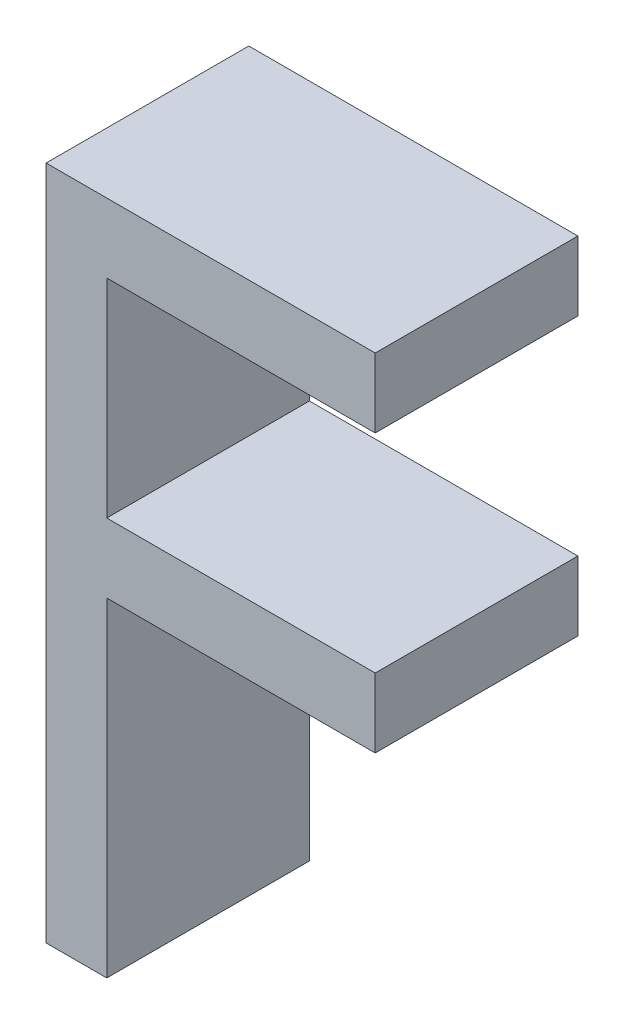
ISO-10303-21;
HEADER;
FILE_DESCRIPTION(('STEP AP214'),'2;1');
FILE_NAME('part.step','',(''),(''),'','','');
FILE_SCHEMA(('AUTOMOTIVE_DESIGN { 1 0 10303 214 1 1 1 1 }'));
ENDSEC;
DATA;
#1=APPLICATION_CONTEXT('core data for automotive mechanical design processes');
#2=APPLICATION_PROTOCOL_DEFINITION('international standard','automotive_design',2000,#1);
#3=PRODUCT_CONTEXT('',#1,'mechanical');
#4=PRODUCT('Part','Part','',(#3));
#5=PRODUCT_RELATED_PRODUCT_CATEGORY('part','',(#4));
#6=PRODUCT_DEFINITION_FORMATION('','',#4);
#7=PRODUCT_DEFINITION_CONTEXT('part definition',#1,'design');
#8=PRODUCT_DEFINITION('design','',#6,#7);
#9=PRODUCT_DEFINITION_SHAPE('','',#8);
#10=(LENGTH_UNIT() NAMED_UNIT(*) SI_UNIT(.MILLI.,.METRE.));
#11=(NAMED_UNIT(*) PLANE_ANGLE_UNIT() SI_UNIT($,.RADIAN.));
#12=(NAMED_UNIT(*) SI_UNIT($,.STERADIAN.) SOLID_ANGLE_UNIT());
#13=UNCERTAINTY_MEASURE_WITH_UNIT(LENGTH_MEASURE(1.E-05),#10,'distance_accuracy_value','');
#14=(GEOMETRIC_REPRESENTATION_CONTEXT(3) GLOBAL_UNCERTAINTY_ASSIGNED_CONTEXT((#13)) GLOBAL_UNIT_ASSIGNED_CONTEXT((#10,
#11,#12)) REPRESENTATION_CONTEXT('',''));
#15=CARTESIAN_POINT('',(0.,0.,0.));
#16=DIRECTION('',(0.,0.,1.));
#17=DIRECTION('',(1.,0.,0.));
#18=AXIS2_PLACEMENT_3D('',#15,#16,#17);
#19=CARTESIAN_POINT('',(-55.4324653258695,-22.8701190762308,1.5));
#20=DIRECTION('',(-1.,0.,0.));
#21=DIRECTION('',(0.,0.,1.));
#22=AXIS2_PLACEMENT_3D('',#19,#20,#21);
#23=PLANE('',#22);
#24=DIRECTION('',(0.,1.,0.));
#25=VECTOR('',#24,1.);
#26=CARTESIAN_POINT('',(-55.4324653258695,-22.8701190762308,0.));
#27=LINE('',#26,#25);
#28=CARTESIAN_POINT('',(-55.4324653258695,-22.8701190762308,0.));
#29=VERTEX_POINT('',#28);
#30=CARTESIAN_POINT('',(-55.4324653258695,-17.8701190762308,0.));
#31=VERTEX_POINT('',#30);
#32=EDGE_CURVE('E142',#29,#31,#27,.T.);
#33=ORIENTED_EDGE('',*,*,#32,.F.);
#34=DIRECTION('',(0.,0.,-1.));
#35=VECTOR('',#34,1.);
#36=CARTESIAN_POINT('',(-55.4324653258695,-22.8701190762308,1.5));
#37=LINE('',#36,#35);
#38=CARTESIAN_POINT('',(-55.4324653258695,-22.8701190762308,1.5));
#39=VERTEX_POINT('',#38);
#40=EDGE_CURVE('E11',#39,#29,#37,.T.);
#41=ORIENTED_EDGE('',*,*,#40,.F.);
#42=DIRECTION('',(0.,1.,0.));
#43=VECTOR('',#42,1.);
#44=CARTESIAN_POINT('',(-55.4324653258695,-22.8701190762308,1.5));
#45=LINE('',#44,#43);
#46=CARTESIAN_POINT('',(-55.4324653258695,-17.8701190762308,1.5));
#47=VERTEX_POINT('',#46);
#48=EDGE_CURVE('E168',#39,#47,#45,.T.);
#49=ORIENTED_EDGE('',*,*,#48,.T.);
#50=DIRECTION('',(0.,0.,-1.));
#51=VECTOR('',#50,1.);
#52=CARTESIAN_POINT('',(-55.4324653258695,-17.8701190762308,1.5));
#53=LINE('',#52,#51);
#54=EDGE_CURVE('E36',#47,#31,#53,.T.);
#55=ORIENTED_EDGE('',*,*,#54,.T.);
#56=EDGE_LOOP('',(#33,#41,#49,#55));
#57=FACE_BOUND('',#56,.T.);
#58=ADVANCED_FACE('F33',(#57),#23,.T.);
#59=CARTESIAN_POINT('',(-54.9837473771516,-22.8701190762308,1.5));
#60=DIRECTION('',(0.,-1.,0.));
#61=DIRECTION('',(0.,0.,-1.));
#62=AXIS2_PLACEMENT_3D('',#59,#60,#61);
#63=PLANE('',#62);
#64=DIRECTION('',(-1.,0.,0.));
#65=VECTOR('',#64,1.);
#66=CARTESIAN_POINT('',(-54.9837473771516,-22.8701190762308,0.));
#67=LINE('',#66,#65);
#68=CARTESIAN_POINT('',(-54.9837473771516,-22.8701190762308,0.));
#69=VERTEX_POINT('',#68);
#70=EDGE_CURVE('E166',#69,#29,#67,.T.);
#71=ORIENTED_EDGE('',*,*,#70,.F.);
#72=DIRECTION('',(0.,0.,-1.));
#73=VECTOR('',#72,1.);
#74=CARTESIAN_POINT('',(-54.9837473771516,-22.8701190762308,1.5));
#75=LINE('',#74,#73);
#76=CARTESIAN_POINT('',(-54.9837473771516,-22.8701190762308,1.5));
#77=VERTEX_POINT('',#76);
#78=EDGE_CURVE('E42',#77,#69,#75,.T.);
#79=ORIENTED_EDGE('',*,*,#78,.F.);
#80=DIRECTION('',(-1.,0.,0.));
#81=VECTOR('',#80,1.);
#82=CARTESIAN_POINT('',(-54.9837473771516,-22.8701190762308,1.5));
#83=LINE('',#82,#81);
#84=EDGE_CURVE('E132',#77,#39,#83,.T.);
#85=ORIENTED_EDGE('',*,*,#84,.T.);
#86=ORIENTED_EDGE('',*,*,#40,.T.);
#87=EDGE_LOOP('',(#71,#79,#85,#86));
#88=FACE_BOUND('',#87,.T.);
#89=ADVANCED_FACE('F184',(#88),#63,.T.);
#90=CARTESIAN_POINT('',(-54.9837473771516,-20.4342216403334,1.5));
#91=DIRECTION('',(1.,0.,0.));
#92=DIRECTION('',(0.,0.,-1.));
#93=AXIS2_PLACEMENT_3D('',#90,#91,#92);
#94=PLANE('',#93);
#95=DIRECTION('',(0.,-1.,0.));
#96=VECTOR('',#95,1.);
#97=CARTESIAN_POINT('',(-54.9837473771516,-20.4342216403334,0.));
#98=LINE('',#97,#96);
#99=CARTESIAN_POINT('',(-54.9837473771516,-20.4342216403334,0.));
#100=VERTEX_POINT('',#99);
#101=EDGE_CURVE('E119',#100,#69,#98,.T.);
#102=ORIENTED_EDGE('',*,*,#101,.F.);
#103=DIRECTION('',(0.,0.,-1.));
#104=VECTOR('',#103,1.);
#105=CARTESIAN_POINT('',(-54.9837473771516,-20.4342216403334,1.5));
#106=LINE('',#105,#104);
#107=CARTESIAN_POINT('',(-54.9837473771516,-20.4342216403334,1.5));
#108=VERTEX_POINT('',#107);
#109=EDGE_CURVE('E114',#108,#100,#106,.T.);
#110=ORIENTED_EDGE('',*,*,#109,.F.);
#111=DIRECTION('',(0.,-1.,0.));
#112=VECTOR('',#111,1.);
#113=CARTESIAN_POINT('',(-54.9837473771516,-20.4342216403334,1.5));
#114=LINE('',#113,#112);
#115=EDGE_CURVE('E117',#108,#77,#114,.T.);
#116=ORIENTED_EDGE('',*,*,#115,.T.);
#117=ORIENTED_EDGE('',*,*,#78,.T.);
#118=EDGE_LOOP('',(#102,#110,#116,#117));
#119=FACE_BOUND('',#118,.T.);
#120=ADVANCED_FACE('F116',(#119),#94,.T.);
#121=CARTESIAN_POINT('',(-52.9965678899721,-20.4342216403334,1.5));
#122=DIRECTION('',(0.,-1.,0.));
#123=DIRECTION('',(0.,0.,-1.));
#124=AXIS2_PLACEMENT_3D('',#121,#122,#123);
#125=PLANE('',#124);
#126=DIRECTION('',(-1.,0.,0.));
#127=VECTOR('',#126,1.);
#128=CARTESIAN_POINT('',(-52.9965678899721,-20.4342216403334,0.));
#129=LINE('',#128,#127);
#130=CARTESIAN_POINT('',(-52.9965678899721,-20.4342216403334,0.));
#131=VERTEX_POINT('',#130);
#132=EDGE_CURVE('E163',#131,#100,#129,.T.);
#133=ORIENTED_EDGE('',*,*,#132,.F.);
#134=DIRECTION('',(0.,0.,-1.));
#135=VECTOR('',#134,1.);
#136=CARTESIAN_POINT('',(-52.9965678899721,-20.4342216403334,1.5));
#137=LINE('',#136,#135);
#138=CARTESIAN_POINT('',(-52.9965678899721,-20.4342216403334,1.5));
#139=VERTEX_POINT('',#138);
#140=EDGE_CURVE('E124',#139,#131,#137,.T.);
#141=ORIENTED_EDGE('',*,*,#140,.F.);
#142=DIRECTION('',(-1.,0.,0.));
#143=VECTOR('',#142,1.);
#144=CARTESIAN_POINT('',(-52.9965678899721,-20.4342216403334,1.5));
#145=LINE('',#144,#143);
#146=EDGE_CURVE('E130',#139,#108,#145,.T.);
#147=ORIENTED_EDGE('',*,*,#146,.T.);
#148=ORIENTED_EDGE('',*,*,#109,.T.);
#149=EDGE_LOOP('',(#133,#141,#147,#148));
#150=FACE_BOUND('',#149,.T.);
#151=ADVANCED_FACE('F134',(#150),#125,.T.);
#152=CARTESIAN_POINT('',(-52.9965678899721,-19.9214011275129,1.5));
#153=DIRECTION('',(1.,0.,0.));
#154=DIRECTION('',(0.,0.,-1.));
#155=AXIS2_PLACEMENT_3D('',#152,#153,#154);
#156=PLANE('',#155);
#157=DIRECTION('',(0.,-1.,0.));
#158=VECTOR('',#157,1.);
#159=CARTESIAN_POINT('',(-52.9965678899721,-19.9214011275129,0.));
#160=LINE('',#159,#158);
#161=CARTESIAN_POINT('',(-52.9965678899721,-19.9214011275129,0.));
#162=VERTEX_POINT('',#161);
#163=EDGE_CURVE('E160',#162,#131,#160,.T.);
#164=ORIENTED_EDGE('',*,*,#163,.F.);
#165=DIRECTION('',(0.,0.,-1.));
#166=VECTOR('',#165,1.);
#167=CARTESIAN_POINT('',(-52.9965678899721,-19.9214011275129,1.5));
#168=LINE('',#167,#166);
#169=CARTESIAN_POINT('',(-52.9965678899721,-19.9214011275129,1.5));
#170=VERTEX_POINT('',#169);
#171=EDGE_CURVE('E172',#170,#162,#168,.T.);
#172=ORIENTED_EDGE('',*,*,#171,.F.);
#173=DIRECTION('',(0.,-1.,0.));
#174=VECTOR('',#173,1.);
#175=CARTESIAN_POINT('',(-52.9965678899721,-19.9214011275129,1.5));
#176=LINE('',#175,#174);
#177=EDGE_CURVE('E135',#170,#139,#176,.T.);
#178=ORIENTED_EDGE('',*,*,#177,.T.);
#179=ORIENTED_EDGE('',*,*,#140,.T.);
#180=EDGE_LOOP('',(#164,#172,#178,#179));
#181=FACE_BOUND('',#180,.T.);
#182=ADVANCED_FACE('F197',(#181),#156,.T.);
#183=CARTESIAN_POINT('',(-54.9837473771516,-19.9214011275129,1.5));
#184=DIRECTION('',(0.,1.,0.));
#185=DIRECTION('',(0.,0.,1.));
#186=AXIS2_PLACEMENT_3D('',#183,#184,#185);
#187=PLANE('',#186);
#188=DIRECTION('',(1.,0.,0.));
#189=VECTOR('',#188,1.);
#190=CARTESIAN_POINT('',(-54.9837473771516,-19.9214011275129,0.));
#191=LINE('',#190,#189);
#192=CARTESIAN_POINT('',(-54.9837473771516,-19.9214011275129,0.));
#193=VERTEX_POINT('',#192);
#194=EDGE_CURVE('E157',#193,#162,#191,.T.);
#195=ORIENTED_EDGE('',*,*,#194,.F.);
#196=DIRECTION('',(0.,0.,-1.));
#197=VECTOR('',#196,1.);
#198=CARTESIAN_POINT('',(-54.9837473771516,-19.9214011275129,1.5));
#199=LINE('',#198,#197);
#200=CARTESIAN_POINT('',(-54.9837473771516,-19.9214011275129,1.5));
#201=VERTEX_POINT('',#200);
#202=EDGE_CURVE('E174',#201,#193,#199,.T.);
#203=ORIENTED_EDGE('',*,*,#202,.F.);
#204=DIRECTION('',(1.,0.,0.));
#205=VECTOR('',#204,1.);
#206=CARTESIAN_POINT('',(-54.9837473771516,-19.9214011275129,1.5));
#207=LINE('',#206,#205);
#208=EDGE_CURVE('E137',#201,#170,#207,.T.);
#209=ORIENTED_EDGE('',*,*,#208,.T.);
#210=ORIENTED_EDGE('',*,*,#171,.T.);
#211=EDGE_LOOP('',(#195,#203,#209,#210));
#212=FACE_BOUND('',#211,.T.);
#213=ADVANCED_FACE('F200',(#212),#187,.T.);
#214=CARTESIAN_POINT('',(-54.9837473771516,-18.3829395890513,1.5));
#215=DIRECTION('',(1.,0.,0.));
#216=DIRECTION('',(0.,0.,-1.));
#217=AXIS2_PLACEMENT_3D('',#214,#215,#216);
#218=PLANE('',#217);
#219=DIRECTION('',(0.,-1.,0.));
#220=VECTOR('',#219,1.);
#221=CARTESIAN_POINT('',(-54.9837473771516,-18.3829395890513,0.));
#222=LINE('',#221,#220);
#223=CARTESIAN_POINT('',(-54.9837473771516,-18.3829395890513,0.));
#224=VERTEX_POINT('',#223);
#225=EDGE_CURVE('E154',#224,#193,#222,.T.);
#226=ORIENTED_EDGE('',*,*,#225,.F.);
#227=DIRECTION('',(0.,0.,-1.));
#228=VECTOR('',#227,1.);
#229=CARTESIAN_POINT('',(-54.9837473771516,-18.3829395890513,1.5));
#230=LINE('',#229,#228);
#231=CARTESIAN_POINT('',(-54.9837473771516,-18.3829395890513,1.5));
#232=VERTEX_POINT('',#231);
#233=EDGE_CURVE('E176',#232,#224,#230,.T.);
#234=ORIENTED_EDGE('',*,*,#233,.F.);
#235=DIRECTION('',(0.,-1.,0.));
#236=VECTOR('',#235,1.);
#237=CARTESIAN_POINT('',(-54.9837473771516,-18.3829395890513,1.5));
#238=LINE('',#237,#236);
#239=EDGE_CURVE('E317',#232,#201,#238,.T.);
#240=ORIENTED_EDGE('',*,*,#239,.T.);
#241=ORIENTED_EDGE('',*,*,#202,.T.);
#242=EDGE_LOOP('',(#226,#234,#240,#241));
#243=FACE_BOUND('',#242,.T.);
#244=ADVANCED_FACE('F204',(#243),#218,.T.);
#245=CARTESIAN_POINT('',(-52.9965678899721,-18.3829395890513,1.5));
#246=DIRECTION('',(0.,-1.,0.));
#247=DIRECTION('',(0.,0.,-1.));
#248=AXIS2_PLACEMENT_3D('',#245,#246,#247);
#249=PLANE('',#248);
#250=DIRECTION('',(-1.,0.,0.));
#251=VECTOR('',#250,1.);
#252=CARTESIAN_POINT('',(-52.9965678899721,-18.3829395890513,0.));
#253=LINE('',#252,#251);
#254=CARTESIAN_POINT('',(-52.9965678899721,-18.3829395890513,0.));
#255=VERTEX_POINT('',#254);
#256=EDGE_CURVE('E151',#255,#224,#253,.T.);
#257=ORIENTED_EDGE('',*,*,#256,.F.);
#258=DIRECTION('',(0.,0.,-1.));
#259=VECTOR('',#258,1.);
#260=CARTESIAN_POINT('',(-52.9965678899721,-18.3829395890513,1.5));
#261=LINE('',#260,#259);
#262=CARTESIAN_POINT('',(-52.9965678899721,-18.3829395890513,1.5));
#263=VERTEX_POINT('',#262);
#264=EDGE_CURVE('E178',#263,#255,#261,.T.);
#265=ORIENTED_EDGE('',*,*,#264,.F.);
#266=DIRECTION('',(-1.,0.,0.));
#267=VECTOR('',#266,1.);
#268=CARTESIAN_POINT('',(-52.9965678899721,-18.3829395890513,1.5));
#269=LINE('',#268,#267);
#270=EDGE_CURVE('E313',#263,#232,#269,.T.);
#271=ORIENTED_EDGE('',*,*,#270,.T.);
#272=ORIENTED_EDGE('',*,*,#233,.T.);
#273=EDGE_LOOP('',(#257,#265,#271,#272));
#274=FACE_BOUND('',#273,.T.);
#275=ADVANCED_FACE('F208',(#274),#249,.T.);
#276=CARTESIAN_POINT('',(-52.9965678899721,-17.8701190762308,1.5));
#277=DIRECTION('',(1.,0.,0.));
#278=DIRECTION('',(0.,0.,-1.));
#279=AXIS2_PLACEMENT_3D('',#276,#277,#278);
#280=PLANE('',#279);
#281=DIRECTION('',(0.,-1.,0.));
#282=VECTOR('',#281,1.);
#283=CARTESIAN_POINT('',(-52.9965678899721,-17.8701190762308,0.));
#284=LINE('',#283,#282);
#285=CARTESIAN_POINT('',(-52.9965678899721,-17.8701190762308,0.));
#286=VERTEX_POINT('',#285);
#287=EDGE_CURVE('E148',#286,#255,#284,.T.);
#288=ORIENTED_EDGE('',*,*,#287,.F.);
#289=DIRECTION('',(0.,0.,-1.));
#290=VECTOR('',#289,1.);
#291=CARTESIAN_POINT('',(-52.9965678899721,-17.8701190762308,1.5));
#292=LINE('',#291,#290);
#293=CARTESIAN_POINT('',(-52.9965678899721,-17.8701190762308,1.5));
#294=VERTEX_POINT('',#293);
#295=EDGE_CURVE('E179',#294,#286,#292,.T.);
#296=ORIENTED_EDGE('',*,*,#295,.F.);
#297=DIRECTION('',(0.,-1.,0.));
#298=VECTOR('',#297,1.);
#299=CARTESIAN_POINT('',(-52.9965678899721,-17.8701190762308,1.5));
#300=LINE('',#299,#298);
#301=EDGE_CURVE('E324',#294,#263,#300,.T.);
#302=ORIENTED_EDGE('',*,*,#301,.T.);
#303=ORIENTED_EDGE('',*,*,#264,.T.);
#304=EDGE_LOOP('',(#288,#296,#302,#303));
#305=FACE_BOUND('',#304,.T.);
#306=ADVANCED_FACE('F212',(#305),#280,.T.);
#307=CARTESIAN_POINT('',(-55.4324653258695,-17.8701190762308,1.5));
#308=DIRECTION('',(0.,1.,0.));
#309=DIRECTION('',(0.,0.,1.));
#310=AXIS2_PLACEMENT_3D('',#307,#308,#309);
#311=PLANE('',#310);
#312=DIRECTION('',(1.,0.,0.));
#313=VECTOR('',#312,1.);
#314=CARTESIAN_POINT('',(-55.4324653258695,-17.8701190762308,0.));
#315=LINE('',#314,#313);
#316=EDGE_CURVE('E145',#31,#286,#315,.T.);
#317=ORIENTED_EDGE('',*,*,#316,.F.);
#318=ORIENTED_EDGE('',*,*,#54,.F.);
#319=DIRECTION('',(1.,0.,0.));
#320=VECTOR('',#319,1.);
#321=CARTESIAN_POINT('',(-55.4324653258695,-17.8701190762308,1.5));
#322=LINE('',#321,#320);
#323=EDGE_CURVE('E326',#47,#294,#322,.T.);
#324=ORIENTED_EDGE('',*,*,#323,.T.);
#325=ORIENTED_EDGE('',*,*,#295,.T.);
#326=EDGE_LOOP('',(#317,#318,#324,#325));
#327=FACE_BOUND('',#326,.T.);
#328=ADVANCED_FACE('F181',(#327),#311,.T.);
#329=CARTESIAN_POINT('',(0.,0.,1.5));
#330=DIRECTION('',(0.,0.,-1.));
#331=DIRECTION('',(-1.,0.,0.));
#332=AXIS2_PLACEMENT_3D('',#329,#330,#331);
#333=PLANE('',#332);
#334=ORIENTED_EDGE('',*,*,#48,.F.);
#335=ORIENTED_EDGE('',*,*,#84,.F.);
#336=ORIENTED_EDGE('',*,*,#115,.F.);
#337=ORIENTED_EDGE('',*,*,#146,.F.);
#338=ORIENTED_EDGE('',*,*,#177,.F.);
#339=ORIENTED_EDGE('',*,*,#208,.F.);
#340=ORIENTED_EDGE('',*,*,#239,.F.);
#341=ORIENTED_EDGE('',*,*,#270,.F.);
#342=ORIENTED_EDGE('',*,*,#301,.F.);
#343=ORIENTED_EDGE('',*,*,#323,.F.);
#344=EDGE_LOOP('',(#334,#335,#336,#337,#338,#339,#340,#341,#342,#343));
#345=FACE_BOUND('',#344,.T.);
#346=ADVANCED_FACE('F128',(#345),#333,.F.);
#347=CARTESIAN_POINT('',(0.,0.,0.));
#348=DIRECTION('',(0.,0.,-1.));
#349=DIRECTION('',(-1.,0.,0.));
#350=AXIS2_PLACEMENT_3D('',#347,#348,#349);
#351=PLANE('',#350);
#352=ORIENTED_EDGE('',*,*,#32,.T.);
#353=ORIENTED_EDGE('',*,*,#316,.T.);
#354=ORIENTED_EDGE('',*,*,#287,.T.);
#355=ORIENTED_EDGE('',*,*,#256,.T.);
#356=ORIENTED_EDGE('',*,*,#225,.T.);
#357=ORIENTED_EDGE('',*,*,#194,.T.);
#358=ORIENTED_EDGE('',*,*,#163,.T.);
#359=ORIENTED_EDGE('',*,*,#132,.T.);
#360=ORIENTED_EDGE('',*,*,#101,.T.);
#361=ORIENTED_EDGE('',*,*,#70,.T.);
#362=EDGE_LOOP('',(#352,#353,#354,#355,#356,#357,#358,#359,#360,#361));
#363=FACE_BOUND('',#362,.T.);
#364=ADVANCED_FACE('F183',(#363),#351,.T.);
#365=CLOSED_SHELL('',(#58,#89,#120,#151,#182,#213,#244,#275,#306,#328,#346,#364));
#366=MANIFOLD_SOLID_BREP('B2',#365);
#367=ADVANCED_BREP_SHAPE_REPRESENTATION('',(#18,#366),#14);
#368=SHAPE_DEFINITION_REPRESENTATION(#9,#367);
ENDSEC;
END-ISO-10303-21;
